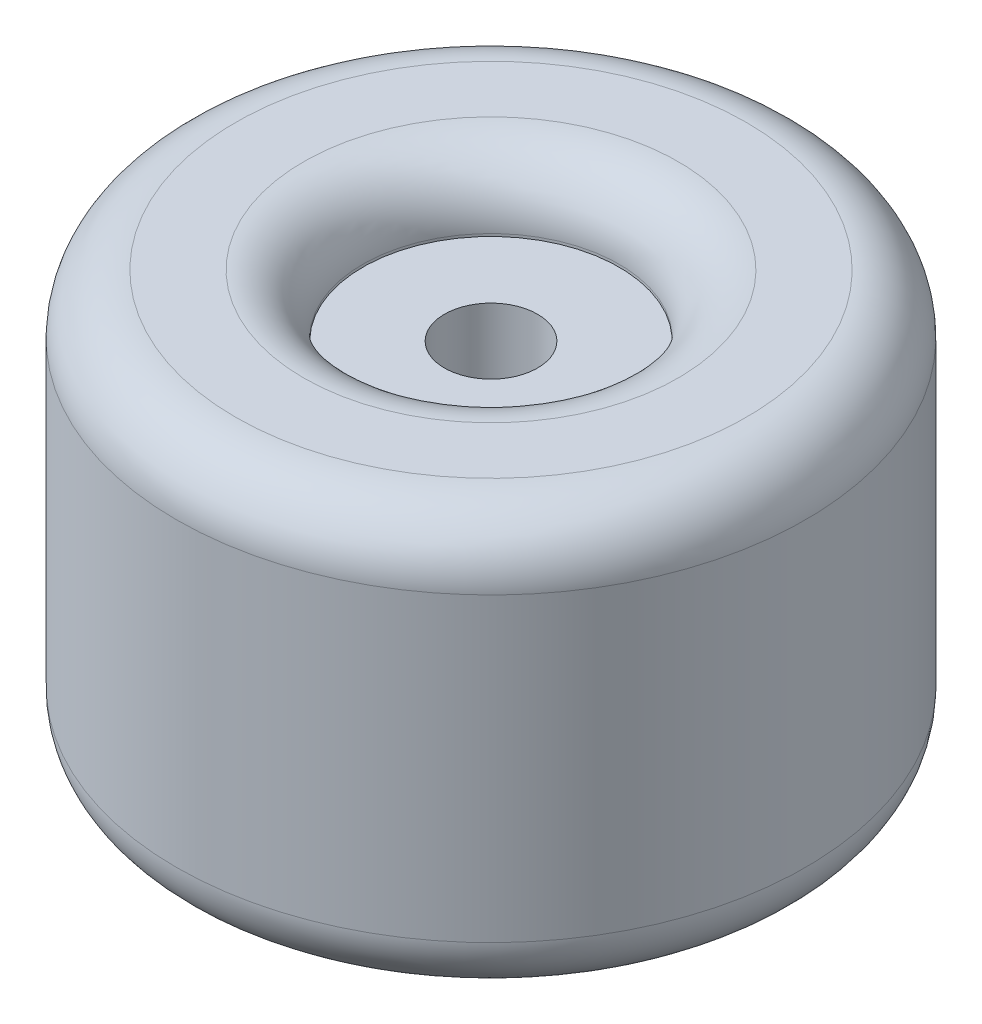
ISO-10303-21;
HEADER;
FILE_DESCRIPTION(('STEP AP214'),'2;1');
FILE_NAME('part.step','',(''),(''),'','','');
FILE_SCHEMA(('AUTOMOTIVE_DESIGN { 1 0 10303 214 1 1 1 1 }'));
ENDSEC;
DATA;
#1=APPLICATION_CONTEXT('core data for automotive mechanical design processes');
#2=APPLICATION_PROTOCOL_DEFINITION('international standard','automotive_design',2000,#1);
#3=PRODUCT_CONTEXT('',#1,'mechanical');
#4=PRODUCT('Part','Part','',(#3));
#5=PRODUCT_RELATED_PRODUCT_CATEGORY('part','',(#4));
#6=PRODUCT_DEFINITION_FORMATION('','',#4);
#7=PRODUCT_DEFINITION_CONTEXT('part definition',#1,'design');
#8=PRODUCT_DEFINITION('design','',#6,#7);
#9=PRODUCT_DEFINITION_SHAPE('','',#8);
#10=(LENGTH_UNIT() NAMED_UNIT(*) SI_UNIT(.MILLI.,.METRE.));
#11=(NAMED_UNIT(*) PLANE_ANGLE_UNIT() SI_UNIT($,.RADIAN.));
#12=(NAMED_UNIT(*) SI_UNIT($,.STERADIAN.) SOLID_ANGLE_UNIT());
#13=UNCERTAINTY_MEASURE_WITH_UNIT(LENGTH_MEASURE(1.E-05),#10,'distance_accuracy_value','');
#14=(GEOMETRIC_REPRESENTATION_CONTEXT(3) GLOBAL_UNCERTAINTY_ASSIGNED_CONTEXT((#13)) GLOBAL_UNIT_ASSIGNED_CONTEXT((#10,
#11,#12)) REPRESENTATION_CONTEXT('',''));
#15=CARTESIAN_POINT('',(0.,0.,0.));
#16=DIRECTION('',(0.,0.,1.));
#17=DIRECTION('',(1.,0.,0.));
#18=AXIS2_PLACEMENT_3D('',#15,#16,#17);
#19=CARTESIAN_POINT('',(0.,12.9197370681842,0.));
#20=DIRECTION('',(0.,1.,0.));
#21=DIRECTION('',(0.,0.,1.));
#22=AXIS2_PLACEMENT_3D('',#19,#20,#21);
#23=TOROIDAL_SURFACE('',#22,21.92,5.08);
#24=CARTESIAN_POINT('',(0.,17.9997370613801,0.));
#25=DIRECTION('',(0.,1.,0.));
#26=DIRECTION('',(0.,0.,1.));
#27=AXIS2_PLACEMENT_3D('',#24,#25,#26);
#28=CIRCLE('',#27,21.9197370749886);
#29=CARTESIAN_POINT('',(0.,17.9997370613801,21.9197370749886));
#30=VERTEX_POINT('',#29);
#31=EDGE_CURVE('E80',#30,#30,#28,.T.);
#32=ORIENTED_EDGE('',*,*,#31,.F.);
#33=EDGE_LOOP('',(#32));
#34=FACE_BOUND('',#33,.T.);
#35=CARTESIAN_POINT('',(0.,12.9197370681842,0.));
#36=DIRECTION('',(0.,1.,0.));
#37=DIRECTION('',(0.,0.,1.));
#38=AXIS2_PLACEMENT_3D('',#35,#36,#37);
#39=CIRCLE('',#38,27.);
#40=CARTESIAN_POINT('',(0.,12.9197370681842,27.));
#41=VERTEX_POINT('',#40);
#42=EDGE_CURVE('E10',#41,#41,#39,.T.);
#43=ORIENTED_EDGE('',*,*,#42,.T.);
#44=EDGE_LOOP('',(#43));
#45=FACE_BOUND('',#44,.T.);
#46=ADVANCED_FACE('F37',(#34,#45),#23,.T.);
#47=CARTESIAN_POINT('',(0.,12.7,0.));
#48=DIRECTION('',(0.,1.,0.));
#49=DIRECTION('',(0.,0.,1.));
#50=AXIS2_PLACEMENT_3D('',#47,#48,#49);
#51=CYLINDRICAL_SURFACE('',#50,27.);
#52=ORIENTED_EDGE('',*,*,#42,.F.);
#53=EDGE_LOOP('',(#52));
#54=FACE_BOUND('',#53,.T.);
#55=CARTESIAN_POINT('',(0.,-12.9197370681842,0.));
#56=DIRECTION('',(0.,1.,0.));
#57=DIRECTION('',(0.,0.,1.));
#58=AXIS2_PLACEMENT_3D('',#55,#56,#57);
#59=CIRCLE('',#58,27.);
#60=CARTESIAN_POINT('',(0.,-12.9197370681842,27.));
#61=VERTEX_POINT('',#60);
#62=EDGE_CURVE('E45',#61,#61,#59,.T.);
#63=ORIENTED_EDGE('',*,*,#62,.T.);
#64=EDGE_LOOP('',(#63));
#65=FACE_BOUND('',#64,.T.);
#66=ADVANCED_FACE('F107',(#54,#65),#51,.T.);
#67=CARTESIAN_POINT('',(0.,-12.9197370681842,0.));
#68=DIRECTION('',(0.,1.,0.));
#69=DIRECTION('',(0.,0.,1.));
#70=AXIS2_PLACEMENT_3D('',#67,#68,#69);
#71=TOROIDAL_SURFACE('',#70,21.92,5.08);
#72=ORIENTED_EDGE('',*,*,#62,.F.);
#73=EDGE_LOOP('',(#72));
#74=FACE_BOUND('',#73,.T.);
#75=CARTESIAN_POINT('',(0.,-17.9997370613801,0.));
#76=DIRECTION('',(0.,1.,0.));
#77=DIRECTION('',(0.,0.,1.));
#78=AXIS2_PLACEMENT_3D('',#75,#76,#77);
#79=CIRCLE('',#78,21.9197370749886);
#80=CARTESIAN_POINT('',(0.,-17.9997370613801,21.9197370749886));
#81=VERTEX_POINT('',#80);
#82=EDGE_CURVE('E50',#81,#81,#79,.T.);
#83=ORIENTED_EDGE('',*,*,#82,.T.);
#84=EDGE_LOOP('',(#83));
#85=FACE_BOUND('',#84,.T.);
#86=ADVANCED_FACE('F112',(#74,#85),#71,.T.);
#87=CARTESIAN_POINT('',(0.,-17.9994348011305,0.));
#88=DIRECTION('',(0.,-1.,0.));
#89=DIRECTION('',(0.,0.,-1.));
#90=AXIS2_PLACEMENT_3D('',#87,#88,#89);
#91=CONICAL_SURFACE('',#90,16.0797370749887,1.57074456990288);
#92=ORIENTED_EDGE('',*,*,#82,.F.);
#93=EDGE_LOOP('',(#92));
#94=FACE_BOUND('',#93,.T.);
#95=CARTESIAN_POINT('',(0.,-17.9994348011305,0.));
#96=DIRECTION('',(0.,1.,0.));
#97=DIRECTION('',(0.,0.,1.));
#98=AXIS2_PLACEMENT_3D('',#95,#96,#97);
#99=CIRCLE('',#98,16.0797370749887);
#100=CARTESIAN_POINT('',(0.,-17.9994348011305,16.0797370749887));
#101=VERTEX_POINT('',#100);
#102=EDGE_CURVE('E56',#101,#101,#99,.T.);
#103=ORIENTED_EDGE('',*,*,#102,.T.);
#104=EDGE_LOOP('',(#103));
#105=FACE_BOUND('',#104,.T.);
#106=ADVANCED_FACE('F119',(#94,#105),#91,.F.);
#107=CARTESIAN_POINT('',(0.,-12.9194348079346,0.));
#108=DIRECTION('',(0.,1.,0.));
#109=DIRECTION('',(0.,0.,1.));
#110=AXIS2_PLACEMENT_3D('',#107,#108,#109);
#111=TOROIDAL_SURFACE('',#110,16.08,5.08);
#112=ORIENTED_EDGE('',*,*,#102,.F.);
#113=EDGE_LOOP('',(#112));
#114=FACE_BOUND('',#113,.T.);
#115=CARTESIAN_POINT('',(0.,-12.9194348079345,0.));
#116=DIRECTION('',(0.,1.,0.));
#117=DIRECTION('',(0.,0.,1.));
#118=AXIS2_PLACEMENT_3D('',#115,#116,#117);
#119=CIRCLE('',#118,11.);
#120=CARTESIAN_POINT('',(0.,-12.9194348079345,11.));
#121=VERTEX_POINT('',#120);
#122=EDGE_CURVE('E60',#121,#121,#119,.T.);
#123=ORIENTED_EDGE('',*,*,#122,.T.);
#124=EDGE_LOOP('',(#123));
#125=FACE_BOUND('',#124,.T.);
#126=ADVANCED_FACE('F126',(#114,#125),#111,.T.);
#127=CARTESIAN_POINT('',(0.,12.7,0.));
#128=DIRECTION('',(0.,1.,0.));
#129=DIRECTION('',(0.,0.,1.));
#130=AXIS2_PLACEMENT_3D('',#127,#128,#129);
#131=CYLINDRICAL_SURFACE('',#130,11.);
#132=ORIENTED_EDGE('',*,*,#122,.F.);
#133=EDGE_LOOP('',(#132));
#134=FACE_BOUND('',#133,.T.);
#135=CARTESIAN_POINT('',(0.,-12.7,0.));
#136=DIRECTION('',(0.,1.,0.));
#137=DIRECTION('',(0.,0.,1.));
#138=AXIS2_PLACEMENT_3D('',#135,#136,#137);
#139=CIRCLE('',#138,11.);
#140=CARTESIAN_POINT('',(0.,-12.7,11.));
#141=VERTEX_POINT('',#140);
#142=EDGE_CURVE('E64',#141,#141,#139,.T.);
#143=ORIENTED_EDGE('',*,*,#142,.T.);
#144=EDGE_LOOP('',(#143));
#145=FACE_BOUND('',#144,.T.);
#146=ADVANCED_FACE('F130',(#134,#145),#131,.F.);
#147=CARTESIAN_POINT('',(0.,-12.7,0.));
#148=DIRECTION('',(0.,1.,0.));
#149=DIRECTION('',(0.,0.,1.));
#150=AXIS2_PLACEMENT_3D('',#147,#148,#149);
#151=PLANE('',#150);
#152=CARTESIAN_POINT('',(0.,-12.7,0.));
#153=DIRECTION('',(0.,-1.,0.));
#154=DIRECTION('',(0.,0.,-1.));
#155=AXIS2_PLACEMENT_3D('',#152,#153,#154);
#156=CIRCLE('',#155,4.);
#157=CARTESIAN_POINT('',(0.,-12.7,-4.));
#158=VERTEX_POINT('',#157);
#159=EDGE_CURVE('E84',#158,#158,#156,.T.);
#160=ORIENTED_EDGE('',*,*,#159,.F.);
#161=EDGE_LOOP('',(#160));
#162=FACE_BOUND('',#161,.T.);
#163=ORIENTED_EDGE('',*,*,#142,.F.);
#164=EDGE_LOOP('',(#163));
#165=FACE_BOUND('',#164,.T.);
#166=ADVANCED_FACE('F134',(#162,#165),#151,.F.);
#167=CARTESIAN_POINT('',(0.,12.7,0.));
#168=DIRECTION('',(0.,-1.,0.));
#169=DIRECTION('',(0.,0.,-1.));
#170=AXIS2_PLACEMENT_3D('',#167,#168,#169);
#171=PLANE('',#170);
#172=CARTESIAN_POINT('',(0.,12.7,0.));
#173=DIRECTION('',(0.,-1.,0.));
#174=DIRECTION('',(0.,0.,-1.));
#175=AXIS2_PLACEMENT_3D('',#172,#173,#174);
#176=CIRCLE('',#175,4.);
#177=CARTESIAN_POINT('',(0.,12.7,-4.));
#178=VERTEX_POINT('',#177);
#179=EDGE_CURVE('E40',#178,#178,#176,.T.);
#180=ORIENTED_EDGE('',*,*,#179,.T.);
#181=EDGE_LOOP('',(#180));
#182=FACE_BOUND('',#181,.T.);
#183=CARTESIAN_POINT('',(0.,12.7,0.));
#184=DIRECTION('',(0.,1.,0.));
#185=DIRECTION('',(0.,0.,1.));
#186=AXIS2_PLACEMENT_3D('',#183,#184,#185);
#187=CIRCLE('',#186,11.);
#188=CARTESIAN_POINT('',(0.,12.7,11.));
#189=VERTEX_POINT('',#188);
#190=EDGE_CURVE('E68',#189,#189,#187,.T.);
#191=ORIENTED_EDGE('',*,*,#190,.T.);
#192=EDGE_LOOP('',(#191));
#193=FACE_BOUND('',#192,.T.);
#194=ADVANCED_FACE('F93',(#182,#193),#171,.F.);
#195=CARTESIAN_POINT('',(0.,12.7,0.));
#196=DIRECTION('',(0.,1.,0.));
#197=DIRECTION('',(0.,0.,1.));
#198=AXIS2_PLACEMENT_3D('',#195,#196,#197);
#199=CYLINDRICAL_SURFACE('',#198,11.);
#200=ORIENTED_EDGE('',*,*,#190,.F.);
#201=EDGE_LOOP('',(#200));
#202=FACE_BOUND('',#201,.T.);
#203=CARTESIAN_POINT('',(0.,12.9194348079345,0.));
#204=DIRECTION('',(0.,1.,0.));
#205=DIRECTION('',(0.,0.,1.));
#206=AXIS2_PLACEMENT_3D('',#203,#204,#205);
#207=CIRCLE('',#206,11.);
#208=CARTESIAN_POINT('',(0.,12.9194348079345,11.));
#209=VERTEX_POINT('',#208);
#210=EDGE_CURVE('E72',#209,#209,#207,.T.);
#211=ORIENTED_EDGE('',*,*,#210,.T.);
#212=EDGE_LOOP('',(#211));
#213=FACE_BOUND('',#212,.T.);
#214=ADVANCED_FACE('F141',(#202,#213),#199,.F.);
#215=CARTESIAN_POINT('',(0.,12.9194348079346,0.));
#216=DIRECTION('',(0.,1.,0.));
#217=DIRECTION('',(0.,0.,1.));
#218=AXIS2_PLACEMENT_3D('',#215,#216,#217);
#219=TOROIDAL_SURFACE('',#218,16.08,5.08);
#220=ORIENTED_EDGE('',*,*,#210,.F.);
#221=EDGE_LOOP('',(#220));
#222=FACE_BOUND('',#221,.T.);
#223=CARTESIAN_POINT('',(0.,17.9994348011305,0.));
#224=DIRECTION('',(0.,1.,0.));
#225=DIRECTION('',(0.,0.,1.));
#226=AXIS2_PLACEMENT_3D('',#223,#224,#225);
#227=CIRCLE('',#226,16.0797370749887);
#228=CARTESIAN_POINT('',(0.,17.9994348011305,16.0797370749887));
#229=VERTEX_POINT('',#228);
#230=EDGE_CURVE('E76',#229,#229,#227,.T.);
#231=ORIENTED_EDGE('',*,*,#230,.T.);
#232=EDGE_LOOP('',(#231));
#233=FACE_BOUND('',#232,.T.);
#234=ADVANCED_FACE('F103',(#222,#233),#219,.T.);
#235=CARTESIAN_POINT('',(0.,17.9997370613801,0.));
#236=DIRECTION('',(0.,1.,0.));
#237=DIRECTION('',(0.,0.,1.));
#238=AXIS2_PLACEMENT_3D('',#235,#236,#237);
#239=CONICAL_SURFACE('',#238,21.9197370749886,1.57074456990288);
#240=ORIENTED_EDGE('',*,*,#230,.F.);
#241=EDGE_LOOP('',(#240));
#242=FACE_BOUND('',#241,.T.);
#243=ORIENTED_EDGE('',*,*,#31,.T.);
#244=EDGE_LOOP('',(#243));
#245=FACE_BOUND('',#244,.T.);
#246=ADVANCED_FACE('F98',(#242,#245),#239,.F.);
#247=CARTESIAN_POINT('',(0.,41.656,0.));
#248=DIRECTION('',(0.,-1.,0.));
#249=DIRECTION('',(0.,0.,-1.));
#250=AXIS2_PLACEMENT_3D('',#247,#248,#249);
#251=CYLINDRICAL_SURFACE('',#250,4.);
#252=ORIENTED_EDGE('',*,*,#159,.T.);
#253=EDGE_LOOP('',(#252));
#254=FACE_BOUND('',#253,.T.);
#255=ORIENTED_EDGE('',*,*,#179,.F.);
#256=EDGE_LOOP('',(#255));
#257=FACE_BOUND('',#256,.T.);
#258=ADVANCED_FACE('F96',(#254,#257),#251,.F.);
#259=CLOSED_SHELL('',(#46,#66,#86,#106,#126,#146,#166,#194,#214,#234,#246,#258));
#260=MANIFOLD_SOLID_BREP('B2',#259);
#261=ADVANCED_BREP_SHAPE_REPRESENTATION('',(#18,#260),#14);
#262=SHAPE_DEFINITION_REPRESENTATION(#9,#261);
ENDSEC;
END-ISO-10303-21;
